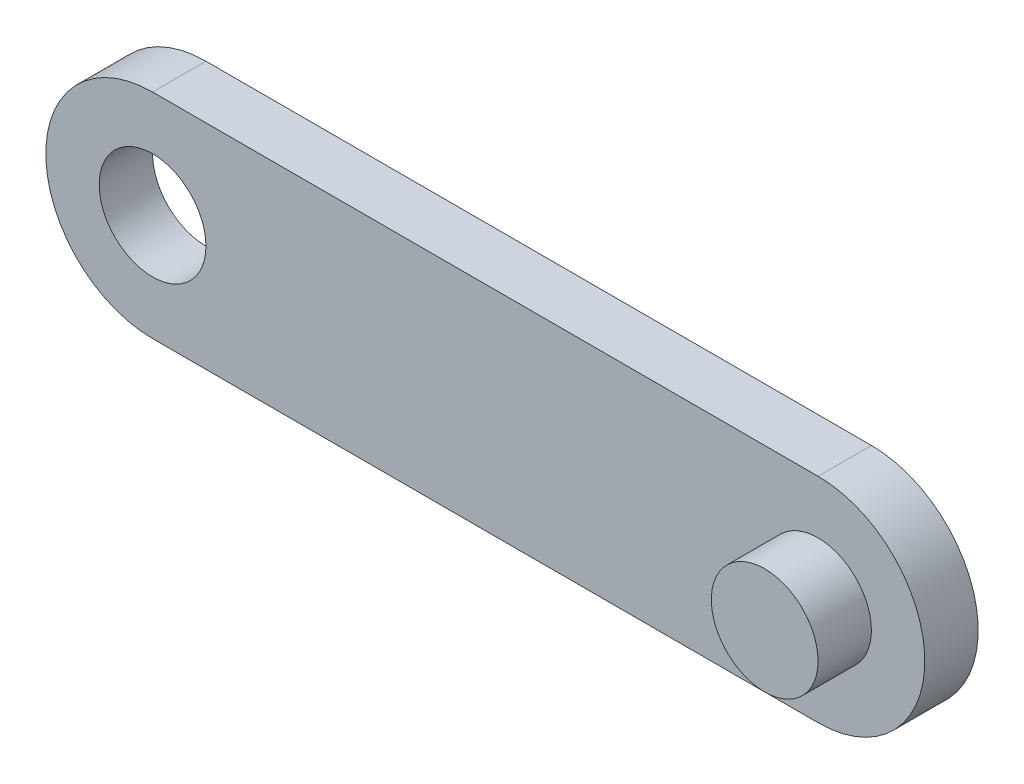
ISO-10303-21;
HEADER;
FILE_DESCRIPTION(('STEP AP214'),'2;1');
FILE_NAME('part.step','',(''),(''),'','','');
FILE_SCHEMA(('AUTOMOTIVE_DESIGN { 1 0 10303 214 1 1 1 1 }'));
ENDSEC;
DATA;
#1=APPLICATION_CONTEXT('core data for automotive mechanical design processes');
#2=APPLICATION_PROTOCOL_DEFINITION('international standard','automotive_design',2000,#1);
#3=PRODUCT_CONTEXT('',#1,'mechanical');
#4=PRODUCT('Part','Part','',(#3));
#5=PRODUCT_RELATED_PRODUCT_CATEGORY('part','',(#4));
#6=PRODUCT_DEFINITION_FORMATION('','',#4);
#7=PRODUCT_DEFINITION_CONTEXT('part definition',#1,'design');
#8=PRODUCT_DEFINITION('design','',#6,#7);
#9=PRODUCT_DEFINITION_SHAPE('','',#8);
#10=(LENGTH_UNIT() NAMED_UNIT(*) SI_UNIT(.MILLI.,.METRE.));
#11=(NAMED_UNIT(*) PLANE_ANGLE_UNIT() SI_UNIT($,.RADIAN.));
#12=(NAMED_UNIT(*) SI_UNIT($,.STERADIAN.) SOLID_ANGLE_UNIT());
#13=UNCERTAINTY_MEASURE_WITH_UNIT(LENGTH_MEASURE(1.E-05),#10,'distance_accuracy_value','');
#14=(GEOMETRIC_REPRESENTATION_CONTEXT(3) GLOBAL_UNCERTAINTY_ASSIGNED_CONTEXT((#13)) GLOBAL_UNIT_ASSIGNED_CONTEXT((#10,
#11,#12)) REPRESENTATION_CONTEXT('',''));
#15=CARTESIAN_POINT('',(0.,0.,0.));
#16=DIRECTION('',(0.,0.,1.));
#17=DIRECTION('',(1.,0.,0.));
#18=AXIS2_PLACEMENT_3D('',#15,#16,#17);
#19=CARTESIAN_POINT('',(0.,0.,10.));
#20=DIRECTION('',(0.,0.,1.));
#21=DIRECTION('',(1.,0.,0.));
#22=AXIS2_PLACEMENT_3D('',#19,#20,#21);
#23=PLANE('',#22);
#24=CARTESIAN_POINT('',(124.680874083399,0.,10.));
#25=DIRECTION('',(0.,0.,1.));
#26=DIRECTION('',(1.,0.,0.));
#27=AXIS2_PLACEMENT_3D('',#24,#25,#26);
#28=CIRCLE('',#27,10.);
#29=CARTESIAN_POINT('',(134.680874083399,0.,10.));
#30=VERTEX_POINT('',#29);
#31=EDGE_CURVE('E118',#30,#30,#28,.T.);
#32=ORIENTED_EDGE('',*,*,#31,.F.);
#33=EDGE_LOOP('',(#32));
#34=FACE_BOUND('',#33,.T.);
#35=CARTESIAN_POINT('',(0.,0.,10.));
#36=DIRECTION('',(0.,0.,1.));
#37=DIRECTION('',(1.,0.,0.));
#38=AXIS2_PLACEMENT_3D('',#35,#36,#37);
#39=CIRCLE('',#38,20.);
#40=CARTESIAN_POINT('',(0.,20.,10.));
#41=VERTEX_POINT('',#40);
#42=CARTESIAN_POINT('',(0.,-20.,10.));
#43=VERTEX_POINT('',#42);
#44=EDGE_CURVE('E85',#41,#43,#39,.T.);
#45=ORIENTED_EDGE('',*,*,#44,.T.);
#46=DIRECTION('',(1.,0.,0.));
#47=VECTOR('',#46,1.);
#48=CARTESIAN_POINT('',(0.,-20.,10.));
#49=LINE('',#48,#47);
#50=CARTESIAN_POINT('',(124.680874083399,-20.,10.));
#51=VERTEX_POINT('',#50);
#52=EDGE_CURVE('E80',#43,#51,#49,.T.);
#53=ORIENTED_EDGE('',*,*,#52,.T.);
#54=CARTESIAN_POINT('',(124.680874083399,0.,10.));
#55=DIRECTION('',(0.,0.,1.));
#56=DIRECTION('',(1.,0.,0.));
#57=AXIS2_PLACEMENT_3D('',#54,#55,#56);
#58=CIRCLE('',#57,20.);
#59=CARTESIAN_POINT('',(124.680874083399,20.,10.));
#60=VERTEX_POINT('',#59);
#61=EDGE_CURVE('E83',#51,#60,#58,.T.);
#62=ORIENTED_EDGE('',*,*,#61,.T.);
#63=DIRECTION('',(-1.,0.,0.));
#64=VECTOR('',#63,1.);
#65=CARTESIAN_POINT('',(0.,20.,10.));
#66=LINE('',#65,#64);
#67=EDGE_CURVE('E50',#60,#41,#66,.T.);
#68=ORIENTED_EDGE('',*,*,#67,.T.);
#69=EDGE_LOOP('',(#45,#53,#62,#68));
#70=FACE_BOUND('',#69,.T.);
#71=CARTESIAN_POINT('',(0.,0.,10.));
#72=DIRECTION('',(0.,0.,1.));
#73=DIRECTION('',(1.,0.,0.));
#74=AXIS2_PLACEMENT_3D('',#71,#72,#73);
#75=CIRCLE('',#74,10.);
#76=CARTESIAN_POINT('',(10.,0.,10.));
#77=VERTEX_POINT('',#76);
#78=EDGE_CURVE('E100',#77,#77,#75,.T.);
#79=ORIENTED_EDGE('',*,*,#78,.F.);
#80=EDGE_LOOP('',(#79));
#81=FACE_BOUND('',#80,.T.);
#82=ADVANCED_FACE('F33',(#34,#70,#81),#23,.T.);
#83=CARTESIAN_POINT('',(0.,0.,0.));
#84=DIRECTION('',(0.,0.,1.));
#85=DIRECTION('',(1.,0.,0.));
#86=AXIS2_PLACEMENT_3D('',#83,#84,#85);
#87=PLANE('',#86);
#88=CARTESIAN_POINT('',(0.,0.,0.));
#89=DIRECTION('',(0.,0.,1.));
#90=DIRECTION('',(1.,0.,0.));
#91=AXIS2_PLACEMENT_3D('',#88,#89,#90);
#92=CIRCLE('',#91,20.);
#93=CARTESIAN_POINT('',(0.,20.,0.));
#94=VERTEX_POINT('',#93);
#95=CARTESIAN_POINT('',(0.,-20.,0.));
#96=VERTEX_POINT('',#95);
#97=EDGE_CURVE('E97',#94,#96,#92,.T.);
#98=ORIENTED_EDGE('',*,*,#97,.F.);
#99=DIRECTION('',(-1.,0.,0.));
#100=VECTOR('',#99,1.);
#101=CARTESIAN_POINT('',(0.,20.,0.));
#102=LINE('',#101,#100);
#103=CARTESIAN_POINT('',(124.680874083399,20.,0.));
#104=VERTEX_POINT('',#103);
#105=EDGE_CURVE('E73',#104,#94,#102,.T.);
#106=ORIENTED_EDGE('',*,*,#105,.F.);
#107=CARTESIAN_POINT('',(124.680874083399,0.,0.));
#108=DIRECTION('',(0.,0.,1.));
#109=DIRECTION('',(1.,0.,0.));
#110=AXIS2_PLACEMENT_3D('',#107,#108,#109);
#111=CIRCLE('',#110,20.);
#112=CARTESIAN_POINT('',(124.680874083399,-20.,0.));
#113=VERTEX_POINT('',#112);
#114=EDGE_CURVE('E67',#113,#104,#111,.T.);
#115=ORIENTED_EDGE('',*,*,#114,.F.);
#116=DIRECTION('',(1.,0.,0.));
#117=VECTOR('',#116,1.);
#118=CARTESIAN_POINT('',(0.,-20.,0.));
#119=LINE('',#118,#117);
#120=EDGE_CURVE('E89',#96,#113,#119,.T.);
#121=ORIENTED_EDGE('',*,*,#120,.F.);
#122=EDGE_LOOP('',(#98,#106,#115,#121));
#123=FACE_BOUND('',#122,.T.);
#124=CARTESIAN_POINT('',(0.,0.,0.));
#125=DIRECTION('',(0.,0.,1.));
#126=DIRECTION('',(1.,0.,0.));
#127=AXIS2_PLACEMENT_3D('',#124,#125,#126);
#128=CIRCLE('',#127,10.);
#129=CARTESIAN_POINT('',(10.,0.,0.));
#130=VERTEX_POINT('',#129);
#131=EDGE_CURVE('E112',#130,#130,#128,.T.);
#132=ORIENTED_EDGE('',*,*,#131,.T.);
#133=EDGE_LOOP('',(#132));
#134=FACE_BOUND('',#133,.T.);
#135=ADVANCED_FACE('F108',(#123,#134),#87,.F.);
#136=CARTESIAN_POINT('',(0.,0.,10.));
#137=DIRECTION('',(0.,0.,-1.));
#138=DIRECTION('',(-1.,0.,0.));
#139=AXIS2_PLACEMENT_3D('',#136,#137,#138);
#140=CYLINDRICAL_SURFACE('',#139,20.);
#141=ORIENTED_EDGE('',*,*,#97,.T.);
#142=DIRECTION('',(0.,0.,-1.));
#143=VECTOR('',#142,1.);
#144=CARTESIAN_POINT('',(0.,-20.,10.));
#145=LINE('',#144,#143);
#146=EDGE_CURVE('E11',#43,#96,#145,.T.);
#147=ORIENTED_EDGE('',*,*,#146,.F.);
#148=ORIENTED_EDGE('',*,*,#44,.F.);
#149=DIRECTION('',(0.,0.,-1.));
#150=VECTOR('',#149,1.);
#151=CARTESIAN_POINT('',(0.,20.,10.));
#152=LINE('',#151,#150);
#153=EDGE_CURVE('E93',#41,#94,#152,.T.);
#154=ORIENTED_EDGE('',*,*,#153,.T.);
#155=EDGE_LOOP('',(#141,#147,#148,#154));
#156=FACE_BOUND('',#155,.T.);
#157=ADVANCED_FACE('F35',(#156),#140,.T.);
#158=CARTESIAN_POINT('',(0.,-20.,10.));
#159=DIRECTION('',(0.,1.,0.));
#160=DIRECTION('',(0.,0.,1.));
#161=AXIS2_PLACEMENT_3D('',#158,#159,#160);
#162=PLANE('',#161);
#163=ORIENTED_EDGE('',*,*,#120,.T.);
#164=DIRECTION('',(0.,0.,-1.));
#165=VECTOR('',#164,1.);
#166=CARTESIAN_POINT('',(124.680874083399,-20.,10.));
#167=LINE('',#166,#165);
#168=EDGE_CURVE('E42',#51,#113,#167,.T.);
#169=ORIENTED_EDGE('',*,*,#168,.F.);
#170=ORIENTED_EDGE('',*,*,#52,.F.);
#171=ORIENTED_EDGE('',*,*,#146,.T.);
#172=EDGE_LOOP('',(#163,#169,#170,#171));
#173=FACE_BOUND('',#172,.T.);
#174=ADVANCED_FACE('F88',(#173),#162,.F.);
#175=CARTESIAN_POINT('',(124.680874083399,0.,10.));
#176=DIRECTION('',(0.,0.,-1.));
#177=DIRECTION('',(-1.,0.,0.));
#178=AXIS2_PLACEMENT_3D('',#175,#176,#177);
#179=CYLINDRICAL_SURFACE('',#178,20.);
#180=ORIENTED_EDGE('',*,*,#114,.T.);
#181=DIRECTION('',(0.,0.,-1.));
#182=VECTOR('',#181,1.);
#183=CARTESIAN_POINT('',(124.680874083399,20.,10.));
#184=LINE('',#183,#182);
#185=EDGE_CURVE('E90',#60,#104,#184,.T.);
#186=ORIENTED_EDGE('',*,*,#185,.F.);
#187=ORIENTED_EDGE('',*,*,#61,.F.);
#188=ORIENTED_EDGE('',*,*,#168,.T.);
#189=EDGE_LOOP('',(#180,#186,#187,#188));
#190=FACE_BOUND('',#189,.T.);
#191=ADVANCED_FACE('F91',(#190),#179,.T.);
#192=CARTESIAN_POINT('',(0.,20.,10.));
#193=DIRECTION('',(0.,-1.,0.));
#194=DIRECTION('',(0.,0.,-1.));
#195=AXIS2_PLACEMENT_3D('',#192,#193,#194);
#196=PLANE('',#195);
#197=ORIENTED_EDGE('',*,*,#105,.T.);
#198=ORIENTED_EDGE('',*,*,#153,.F.);
#199=ORIENTED_EDGE('',*,*,#67,.F.);
#200=ORIENTED_EDGE('',*,*,#185,.T.);
#201=EDGE_LOOP('',(#197,#198,#199,#200));
#202=FACE_BOUND('',#201,.T.);
#203=ADVANCED_FACE('F105',(#202),#196,.F.);
#204=CARTESIAN_POINT('',(0.,0.,10.));
#205=DIRECTION('',(0.,0.,-1.));
#206=DIRECTION('',(-1.,0.,0.));
#207=AXIS2_PLACEMENT_3D('',#204,#205,#206);
#208=CYLINDRICAL_SURFACE('',#207,10.);
#209=ORIENTED_EDGE('',*,*,#78,.T.);
#210=EDGE_LOOP('',(#209));
#211=FACE_BOUND('',#210,.T.);
#212=ORIENTED_EDGE('',*,*,#131,.F.);
#213=EDGE_LOOP('',(#212));
#214=FACE_BOUND('',#213,.T.);
#215=ADVANCED_FACE('F129',(#211,#214),#208,.F.);
#216=CARTESIAN_POINT('',(124.680874083399,0.,20.));
#217=DIRECTION('',(0.,0.,-1.));
#218=DIRECTION('',(-1.,0.,0.));
#219=AXIS2_PLACEMENT_3D('',#216,#217,#218);
#220=CYLINDRICAL_SURFACE('',#219,10.);
#221=CARTESIAN_POINT('',(124.680874083399,0.,20.));
#222=DIRECTION('',(0.,0.,1.));
#223=DIRECTION('',(1.,0.,0.));
#224=AXIS2_PLACEMENT_3D('',#221,#222,#223);
#225=CIRCLE('',#224,10.);
#226=CARTESIAN_POINT('',(134.680874083399,0.,20.));
#227=VERTEX_POINT('',#226);
#228=EDGE_CURVE('E115',#227,#227,#225,.T.);
#229=ORIENTED_EDGE('',*,*,#228,.F.);
#230=EDGE_LOOP('',(#229));
#231=FACE_BOUND('',#230,.T.);
#232=ORIENTED_EDGE('',*,*,#31,.T.);
#233=EDGE_LOOP('',(#232));
#234=FACE_BOUND('',#233,.T.);
#235=ADVANCED_FACE('F126',(#231,#234),#220,.T.);
#236=CARTESIAN_POINT('',(124.680874083399,0.,20.));
#237=DIRECTION('',(0.,0.,1.));
#238=DIRECTION('',(1.,0.,0.));
#239=AXIS2_PLACEMENT_3D('',#236,#237,#238);
#240=PLANE('',#239);
#241=ORIENTED_EDGE('',*,*,#228,.T.);
#242=EDGE_LOOP('',(#241));
#243=FACE_BOUND('',#242,.T.);
#244=ADVANCED_FACE('F124',(#243),#240,.T.);
#245=CLOSED_SHELL('',(#82,#135,#157,#174,#191,#203,#215,#235,#244));
#246=MANIFOLD_SOLID_BREP('B2',#245);
#247=ADVANCED_BREP_SHAPE_REPRESENTATION('',(#18,#246),#14);
#248=SHAPE_DEFINITION_REPRESENTATION(#9,#247);
ENDSEC;
END-ISO-10303-21;
